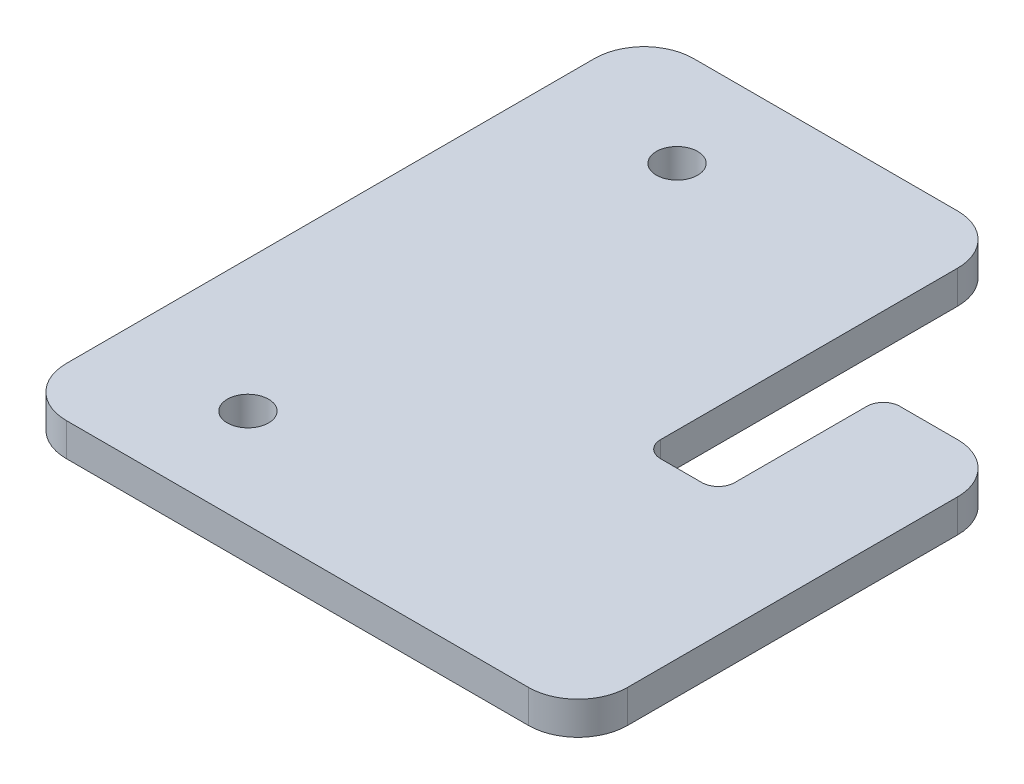
ISO-10303-21;
HEADER;
FILE_DESCRIPTION(('STEP AP214'),'2;1');
FILE_NAME('part.step','',(''),(''),'','','');
FILE_SCHEMA(('AUTOMOTIVE_DESIGN { 1 0 10303 214 1 1 1 1 }'));
ENDSEC;
DATA;
#1=APPLICATION_CONTEXT('core data for automotive mechanical design processes');
#2=APPLICATION_PROTOCOL_DEFINITION('international standard','automotive_design',2000,#1);
#3=PRODUCT_CONTEXT('',#1,'mechanical');
#4=PRODUCT('Part','Part','',(#3));
#5=PRODUCT_RELATED_PRODUCT_CATEGORY('part','',(#4));
#6=PRODUCT_DEFINITION_FORMATION('','',#4);
#7=PRODUCT_DEFINITION_CONTEXT('part definition',#1,'design');
#8=PRODUCT_DEFINITION('design','',#6,#7);
#9=PRODUCT_DEFINITION_SHAPE('','',#8);
#10=(LENGTH_UNIT() NAMED_UNIT(*) SI_UNIT(.MILLI.,.METRE.));
#11=(NAMED_UNIT(*) PLANE_ANGLE_UNIT() SI_UNIT($,.RADIAN.));
#12=(NAMED_UNIT(*) SI_UNIT($,.STERADIAN.) SOLID_ANGLE_UNIT());
#13=UNCERTAINTY_MEASURE_WITH_UNIT(LENGTH_MEASURE(1.E-05),#10,'distance_accuracy_value','');
#14=(GEOMETRIC_REPRESENTATION_CONTEXT(3) GLOBAL_UNCERTAINTY_ASSIGNED_CONTEXT((#13)) GLOBAL_UNIT_ASSIGNED_CONTEXT((#10,
#11,#12)) REPRESENTATION_CONTEXT('',''));
#15=CARTESIAN_POINT('',(0.,0.,0.));
#16=DIRECTION('',(0.,0.,1.));
#17=DIRECTION('',(1.,0.,0.));
#18=AXIS2_PLACEMENT_3D('',#15,#16,#17);
#19=CARTESIAN_POINT('',(-17.,-2.,19.));
#20=DIRECTION('',(-1.,0.,0.));
#21=DIRECTION('',(0.,0.,1.));
#22=AXIS2_PLACEMENT_3D('',#19,#20,#21);
#23=PLANE('',#22);
#24=DIRECTION('',(0.,0.,1.));
#25=VECTOR('',#24,1.);
#26=CARTESIAN_POINT('',(-17.,0.,19.));
#27=LINE('',#26,#25);
#28=CARTESIAN_POINT('',(-17.,0.,-16.));
#29=VERTEX_POINT('',#28);
#30=CARTESIAN_POINT('',(-17.,0.,16.));
#31=VERTEX_POINT('',#30);
#32=EDGE_CURVE('E256',#29,#31,#27,.T.);
#33=ORIENTED_EDGE('',*,*,#32,.F.);
#34=DIRECTION('',(0.,1.,0.));
#35=VECTOR('',#34,1.);
#36=CARTESIAN_POINT('',(-17.,-2.,-16.));
#37=LINE('',#36,#35);
#38=CARTESIAN_POINT('',(-17.,-2.,-16.));
#39=VERTEX_POINT('',#38);
#40=EDGE_CURVE('E11',#29,#39,#37,.F.);
#41=ORIENTED_EDGE('',*,*,#40,.T.);
#42=DIRECTION('',(0.,0.,1.));
#43=VECTOR('',#42,1.);
#44=CARTESIAN_POINT('',(-17.,-2.,19.));
#45=LINE('',#44,#43);
#46=CARTESIAN_POINT('',(-17.,-2.,16.));
#47=VERTEX_POINT('',#46);
#48=EDGE_CURVE('E259',#39,#47,#45,.T.);
#49=ORIENTED_EDGE('',*,*,#48,.T.);
#50=DIRECTION('',(0.,1.,0.));
#51=VECTOR('',#50,1.);
#52=CARTESIAN_POINT('',(-17.,-2.,16.));
#53=LINE('',#52,#51);
#54=EDGE_CURVE('E57',#47,#31,#53,.T.);
#55=ORIENTED_EDGE('',*,*,#54,.T.);
#56=EDGE_LOOP('',(#33,#41,#49,#55));
#57=FACE_BOUND('',#56,.T.);
#58=ADVANCED_FACE('F49',(#57),#23,.T.);
#59=CARTESIAN_POINT('',(17.,-2.,-19.));
#60=DIRECTION('',(0.,0.,-1.));
#61=DIRECTION('',(-1.,0.,0.));
#62=AXIS2_PLACEMENT_3D('',#59,#60,#61);
#63=PLANE('',#62);
#64=DIRECTION('',(-1.,0.,0.));
#65=VECTOR('',#64,1.);
#66=CARTESIAN_POINT('',(17.,0.,-19.));
#67=LINE('',#66,#65);
#68=CARTESIAN_POINT('',(1.99999999999999,0.,-19.));
#69=VERTEX_POINT('',#68);
#70=CARTESIAN_POINT('',(-14.,0.,-19.));
#71=VERTEX_POINT('',#70);
#72=EDGE_CURVE('E276',#69,#71,#67,.T.);
#73=ORIENTED_EDGE('',*,*,#72,.F.);
#74=DIRECTION('',(0.,1.,0.));
#75=VECTOR('',#74,1.);
#76=CARTESIAN_POINT('',(1.99999999999999,-2.,-19.));
#77=LINE('',#76,#75);
#78=CARTESIAN_POINT('',(1.99999999999999,-2.,-19.));
#79=VERTEX_POINT('',#78);
#80=EDGE_CURVE('E250',#69,#79,#77,.F.);
#81=ORIENTED_EDGE('',*,*,#80,.T.);
#82=DIRECTION('',(-1.,0.,0.));
#83=VECTOR('',#82,1.);
#84=CARTESIAN_POINT('',(17.,-2.,-19.));
#85=LINE('',#84,#83);
#86=CARTESIAN_POINT('',(-14.,-2.,-19.));
#87=VERTEX_POINT('',#86);
#88=EDGE_CURVE('E272',#79,#87,#85,.T.);
#89=ORIENTED_EDGE('',*,*,#88,.T.);
#90=DIRECTION('',(0.,1.,0.));
#91=VECTOR('',#90,1.);
#92=CARTESIAN_POINT('',(-14.,-2.,-19.));
#93=LINE('',#92,#91);
#94=EDGE_CURVE('E247',#87,#71,#93,.T.);
#95=ORIENTED_EDGE('',*,*,#94,.T.);
#96=EDGE_LOOP('',(#73,#81,#89,#95));
#97=FACE_BOUND('',#96,.T.);
#98=ADVANCED_FACE('F328',(#97),#63,.T.);
#99=CARTESIAN_POINT('',(17.,-2.,19.));
#100=DIRECTION('',(1.,0.,0.));
#101=DIRECTION('',(0.,0.,-1.));
#102=AXIS2_PLACEMENT_3D('',#99,#100,#101);
#103=PLANE('',#102);
#104=DIRECTION('',(0.,0.,-1.));
#105=VECTOR('',#104,1.);
#106=CARTESIAN_POINT('',(17.,-2.,19.));
#107=LINE('',#106,#105);
#108=CARTESIAN_POINT('',(17.,-2.,16.));
#109=VERTEX_POINT('',#108);
#110=CARTESIAN_POINT('',(17.,-2.,-4.));
#111=VERTEX_POINT('',#110);
#112=EDGE_CURVE('E318',#109,#111,#107,.T.);
#113=ORIENTED_EDGE('',*,*,#112,.T.);
#114=DIRECTION('',(0.,-1.,0.));
#115=VECTOR('',#114,1.);
#116=CARTESIAN_POINT('',(17.,0.,-4.));
#117=LINE('',#116,#115);
#118=CARTESIAN_POINT('',(17.,0.,-4.));
#119=VERTEX_POINT('',#118);
#120=EDGE_CURVE('E231',#111,#119,#117,.F.);
#121=ORIENTED_EDGE('',*,*,#120,.T.);
#122=DIRECTION('',(0.,0.,-1.));
#123=VECTOR('',#122,1.);
#124=CARTESIAN_POINT('',(17.,0.,19.));
#125=LINE('',#124,#123);
#126=CARTESIAN_POINT('',(17.,0.,16.));
#127=VERTEX_POINT('',#126);
#128=EDGE_CURVE('E266',#127,#119,#125,.T.);
#129=ORIENTED_EDGE('',*,*,#128,.F.);
#130=DIRECTION('',(0.,1.,0.));
#131=VECTOR('',#130,1.);
#132=CARTESIAN_POINT('',(17.,-2.,16.));
#133=LINE('',#132,#131);
#134=EDGE_CURVE('E229',#127,#109,#133,.F.);
#135=ORIENTED_EDGE('',*,*,#134,.T.);
#136=EDGE_LOOP('',(#113,#121,#129,#135));
#137=FACE_BOUND('',#136,.T.);
#138=ADVANCED_FACE('F339',(#137),#103,.T.);
#139=CARTESIAN_POINT('',(17.,-2.,19.));
#140=DIRECTION('',(0.,0.,1.));
#141=DIRECTION('',(1.,0.,0.));
#142=AXIS2_PLACEMENT_3D('',#139,#140,#141);
#143=PLANE('',#142);
#144=DIRECTION('',(1.,0.,0.));
#145=VECTOR('',#144,1.);
#146=CARTESIAN_POINT('',(17.,-2.,19.));
#147=LINE('',#146,#145);
#148=CARTESIAN_POINT('',(-14.,-2.,19.));
#149=VERTEX_POINT('',#148);
#150=CARTESIAN_POINT('',(14.,-2.,19.));
#151=VERTEX_POINT('',#150);
#152=EDGE_CURVE('E316',#149,#151,#147,.T.);
#153=ORIENTED_EDGE('',*,*,#152,.T.);
#154=DIRECTION('',(0.,1.,0.));
#155=VECTOR('',#154,1.);
#156=CARTESIAN_POINT('',(14.,-2.,19.));
#157=LINE('',#156,#155);
#158=CARTESIAN_POINT('',(14.,0.,19.));
#159=VERTEX_POINT('',#158);
#160=EDGE_CURVE('E242',#151,#159,#157,.T.);
#161=ORIENTED_EDGE('',*,*,#160,.T.);
#162=DIRECTION('',(1.,0.,0.));
#163=VECTOR('',#162,1.);
#164=CARTESIAN_POINT('',(17.,0.,19.));
#165=LINE('',#164,#163);
#166=CARTESIAN_POINT('',(-14.,0.,19.));
#167=VERTEX_POINT('',#166);
#168=EDGE_CURVE('E263',#167,#159,#165,.T.);
#169=ORIENTED_EDGE('',*,*,#168,.F.);
#170=DIRECTION('',(0.,1.,0.));
#171=VECTOR('',#170,1.);
#172=CARTESIAN_POINT('',(-14.,-2.,19.));
#173=LINE('',#172,#171);
#174=EDGE_CURVE('E240',#167,#149,#173,.F.);
#175=ORIENTED_EDGE('',*,*,#174,.T.);
#176=EDGE_LOOP('',(#153,#161,#169,#175));
#177=FACE_BOUND('',#176,.T.);
#178=ADVANCED_FACE('F337',(#177),#143,.T.);
#179=CARTESIAN_POINT('',(0.,-2.,0.));
#180=DIRECTION('',(0.,1.,0.));
#181=DIRECTION('',(0.,0.,1.));
#182=AXIS2_PLACEMENT_3D('',#179,#180,#181);
#183=PLANE('',#182);
#184=CARTESIAN_POINT('',(-9.00000000000001,-2.,13.));
#185=DIRECTION('',(0.,1.,0.));
#186=DIRECTION('',(0.,0.,1.));
#187=AXIS2_PLACEMENT_3D('',#184,#185,#186);
#188=CIRCLE('',#187,1.25);
#189=CARTESIAN_POINT('',(-9.00000000000001,-2.,14.25));
#190=VERTEX_POINT('',#189);
#191=EDGE_CURVE('E310',#190,#190,#188,.T.);
#192=ORIENTED_EDGE('',*,*,#191,.T.);
#193=EDGE_LOOP('',(#192));
#194=FACE_BOUND('',#193,.T.);
#195=CARTESIAN_POINT('',(-9.00000000000001,-2.,-13.));
#196=DIRECTION('',(0.,1.,0.));
#197=DIRECTION('',(0.,0.,1.));
#198=AXIS2_PLACEMENT_3D('',#195,#196,#197);
#199=CIRCLE('',#198,1.25);
#200=CARTESIAN_POINT('',(-9.00000000000001,-2.,-11.75));
#201=VERTEX_POINT('',#200);
#202=EDGE_CURVE('E264',#201,#201,#199,.T.);
#203=ORIENTED_EDGE('',*,*,#202,.T.);
#204=EDGE_LOOP('',(#203));
#205=FACE_BOUND('',#204,.T.);
#206=DIRECTION('',(1.,0.,0.));
#207=VECTOR('',#206,1.);
#208=CARTESIAN_POINT('',(0.,-2.,-7.00000000000001));
#209=LINE('',#208,#207);
#210=CARTESIAN_POINT('',(10.5,-2.,-7.));
#211=VERTEX_POINT('',#210);
#212=CARTESIAN_POINT('',(14.,-2.,-7.));
#213=VERTEX_POINT('',#212);
#214=EDGE_CURVE('E182',#211,#213,#209,.T.);
#215=ORIENTED_EDGE('',*,*,#214,.T.);
#216=CARTESIAN_POINT('',(14.,-2.,-4.));
#217=DIRECTION('',(0.,1.,0.));
#218=DIRECTION('',(0.,0.,1.));
#219=AXIS2_PLACEMENT_3D('',#216,#217,#218);
#220=CIRCLE('',#219,3.);
#221=EDGE_CURVE('E227',#213,#111,#220,.F.);
#222=ORIENTED_EDGE('',*,*,#221,.T.);
#223=ORIENTED_EDGE('',*,*,#112,.F.);
#224=CARTESIAN_POINT('',(14.,-2.,16.));
#225=DIRECTION('',(0.,1.,0.));
#226=DIRECTION('',(0.,0.,1.));
#227=AXIS2_PLACEMENT_3D('',#224,#225,#226);
#228=CIRCLE('',#227,3.);
#229=EDGE_CURVE('E225',#109,#151,#228,.F.);
#230=ORIENTED_EDGE('',*,*,#229,.T.);
#231=ORIENTED_EDGE('',*,*,#152,.F.);
#232=CARTESIAN_POINT('',(-14.,-2.,16.));
#233=DIRECTION('',(0.,1.,0.));
#234=DIRECTION('',(0.,0.,1.));
#235=AXIS2_PLACEMENT_3D('',#232,#233,#234);
#236=CIRCLE('',#235,3.);
#237=EDGE_CURVE('E219',#149,#47,#236,.F.);
#238=ORIENTED_EDGE('',*,*,#237,.T.);
#239=ORIENTED_EDGE('',*,*,#48,.F.);
#240=CARTESIAN_POINT('',(-14.,-2.,-16.));
#241=DIRECTION('',(0.,1.,0.));
#242=DIRECTION('',(0.,0.,1.));
#243=AXIS2_PLACEMENT_3D('',#240,#241,#242);
#244=CIRCLE('',#243,3.);
#245=EDGE_CURVE('E221',#39,#87,#244,.F.);
#246=ORIENTED_EDGE('',*,*,#245,.T.);
#247=ORIENTED_EDGE('',*,*,#88,.F.);
#248=CARTESIAN_POINT('',(2.,-2.,-16.));
#249=DIRECTION('',(0.,1.,0.));
#250=DIRECTION('',(0.,0.,1.));
#251=AXIS2_PLACEMENT_3D('',#248,#249,#250);
#252=CIRCLE('',#251,3.);
#253=CARTESIAN_POINT('',(4.99999999999999,-2.,-16.));
#254=VERTEX_POINT('',#253);
#255=EDGE_CURVE('E223',#79,#254,#252,.F.);
#256=ORIENTED_EDGE('',*,*,#255,.T.);
#257=DIRECTION('',(0.,0.,1.));
#258=VECTOR('',#257,1.);
#259=CARTESIAN_POINT('',(4.99999999999999,-2.,0.));
#260=LINE('',#259,#258);
#261=CARTESIAN_POINT('',(4.99999999999999,-2.,2.));
#262=VERTEX_POINT('',#261);
#263=EDGE_CURVE('E304',#254,#262,#260,.T.);
#264=ORIENTED_EDGE('',*,*,#263,.T.);
#265=CARTESIAN_POINT('',(5.99999999999999,-2.,2.));
#266=DIRECTION('',(0.,1.,0.));
#267=DIRECTION('',(0.,0.,1.));
#268=AXIS2_PLACEMENT_3D('',#265,#266,#267);
#269=CIRCLE('',#268,1.);
#270=CARTESIAN_POINT('',(5.99999999999999,-2.,3.));
#271=VERTEX_POINT('',#270);
#272=EDGE_CURVE('E215',#262,#271,#269,.T.);
#273=ORIENTED_EDGE('',*,*,#272,.T.);
#274=DIRECTION('',(-1.,0.,0.));
#275=VECTOR('',#274,1.);
#276=CARTESIAN_POINT('',(0.,-2.,3.));
#277=LINE('',#276,#275);
#278=CARTESIAN_POINT('',(8.49999999999999,-2.,3.));
#279=VERTEX_POINT('',#278);
#280=EDGE_CURVE('E298',#279,#271,#277,.T.);
#281=ORIENTED_EDGE('',*,*,#280,.F.);
#282=CARTESIAN_POINT('',(8.49999999999999,-2.,2.));
#283=DIRECTION('',(0.,1.,0.));
#284=DIRECTION('',(0.,0.,1.));
#285=AXIS2_PLACEMENT_3D('',#282,#283,#284);
#286=CIRCLE('',#285,1.);
#287=CARTESIAN_POINT('',(9.49999999999999,-2.,2.));
#288=VERTEX_POINT('',#287);
#289=EDGE_CURVE('E210',#279,#288,#286,.T.);
#290=ORIENTED_EDGE('',*,*,#289,.T.);
#291=DIRECTION('',(0.,0.,-1.));
#292=VECTOR('',#291,1.);
#293=CARTESIAN_POINT('',(9.49999999999999,-2.,0.));
#294=LINE('',#293,#292);
#295=CARTESIAN_POINT('',(9.49999999999999,-2.,-6.));
#296=VERTEX_POINT('',#295);
#297=EDGE_CURVE('E297',#288,#296,#294,.T.);
#298=ORIENTED_EDGE('',*,*,#297,.T.);
#299=CARTESIAN_POINT('',(10.5,-2.,-6.));
#300=DIRECTION('',(0.,1.,0.));
#301=DIRECTION('',(0.,0.,1.));
#302=AXIS2_PLACEMENT_3D('',#299,#300,#301);
#303=CIRCLE('',#302,1.);
#304=EDGE_CURVE('E198',#296,#211,#303,.F.);
#305=ORIENTED_EDGE('',*,*,#304,.T.);
#306=EDGE_LOOP('',(#215,#222,#223,#230,#231,#238,#239,#246,#247,#256,#264,#273,#281,#290,#298,#305));
#307=FACE_BOUND('',#306,.T.);
#308=ADVANCED_FACE('F296',(#194,#205,#307),#183,.F.);
#309=CARTESIAN_POINT('',(0.,0.,0.));
#310=DIRECTION('',(0.,1.,0.));
#311=DIRECTION('',(0.,0.,1.));
#312=AXIS2_PLACEMENT_3D('',#309,#310,#311);
#313=PLANE('',#312);
#314=ORIENTED_EDGE('',*,*,#128,.T.);
#315=CARTESIAN_POINT('',(14.,0.,-4.));
#316=DIRECTION('',(0.,1.,0.));
#317=DIRECTION('',(0.,0.,1.));
#318=AXIS2_PLACEMENT_3D('',#315,#316,#317);
#319=CIRCLE('',#318,3.);
#320=CARTESIAN_POINT('',(14.,0.,-7.));
#321=VERTEX_POINT('',#320);
#322=EDGE_CURVE('E188',#119,#321,#319,.T.);
#323=ORIENTED_EDGE('',*,*,#322,.T.);
#324=DIRECTION('',(1.,0.,0.));
#325=VECTOR('',#324,1.);
#326=CARTESIAN_POINT('',(0.,0.,-7.00000000000001));
#327=LINE('',#326,#325);
#328=CARTESIAN_POINT('',(10.5,0.,-7.));
#329=VERTEX_POINT('',#328);
#330=EDGE_CURVE('E179',#329,#321,#327,.T.);
#331=ORIENTED_EDGE('',*,*,#330,.F.);
#332=CARTESIAN_POINT('',(10.5,0.,-6.));
#333=DIRECTION('',(0.,1.,0.));
#334=DIRECTION('',(0.,0.,1.));
#335=AXIS2_PLACEMENT_3D('',#332,#333,#334);
#336=CIRCLE('',#335,1.);
#337=CARTESIAN_POINT('',(9.49999999999999,0.,-6.));
#338=VERTEX_POINT('',#337);
#339=EDGE_CURVE('E163',#329,#338,#336,.T.);
#340=ORIENTED_EDGE('',*,*,#339,.T.);
#341=DIRECTION('',(0.,0.,-1.));
#342=VECTOR('',#341,1.);
#343=CARTESIAN_POINT('',(9.49999999999999,0.,0.));
#344=LINE('',#343,#342);
#345=CARTESIAN_POINT('',(9.49999999999999,0.,2.));
#346=VERTEX_POINT('',#345);
#347=EDGE_CURVE('E189',#346,#338,#344,.T.);
#348=ORIENTED_EDGE('',*,*,#347,.F.);
#349=CARTESIAN_POINT('',(8.49999999999999,0.,2.));
#350=DIRECTION('',(0.,1.,0.));
#351=DIRECTION('',(0.,0.,1.));
#352=AXIS2_PLACEMENT_3D('',#349,#350,#351);
#353=CIRCLE('',#352,1.);
#354=CARTESIAN_POINT('',(8.49999999999999,0.,3.));
#355=VERTEX_POINT('',#354);
#356=EDGE_CURVE('E208',#346,#355,#353,.F.);
#357=ORIENTED_EDGE('',*,*,#356,.T.);
#358=DIRECTION('',(-1.,0.,0.));
#359=VECTOR('',#358,1.);
#360=CARTESIAN_POINT('',(0.,0.,3.));
#361=LINE('',#360,#359);
#362=CARTESIAN_POINT('',(5.99999999999999,0.,3.));
#363=VERTEX_POINT('',#362);
#364=EDGE_CURVE('E191',#355,#363,#361,.T.);
#365=ORIENTED_EDGE('',*,*,#364,.T.);
#366=CARTESIAN_POINT('',(5.99999999999999,0.,2.));
#367=DIRECTION('',(0.,1.,0.));
#368=DIRECTION('',(0.,0.,1.));
#369=AXIS2_PLACEMENT_3D('',#366,#367,#368);
#370=CIRCLE('',#369,1.);
#371=CARTESIAN_POINT('',(4.99999999999999,0.,2.));
#372=VERTEX_POINT('',#371);
#373=EDGE_CURVE('E212',#363,#372,#370,.F.);
#374=ORIENTED_EDGE('',*,*,#373,.T.);
#375=DIRECTION('',(0.,0.,1.));
#376=VECTOR('',#375,1.);
#377=CARTESIAN_POINT('',(4.99999999999999,0.,0.));
#378=LINE('',#377,#376);
#379=CARTESIAN_POINT('',(4.99999999999999,0.,-16.));
#380=VERTEX_POINT('',#379);
#381=EDGE_CURVE('E278',#380,#372,#378,.T.);
#382=ORIENTED_EDGE('',*,*,#381,.F.);
#383=CARTESIAN_POINT('',(2.,0.,-16.));
#384=DIRECTION('',(0.,1.,0.));
#385=DIRECTION('',(0.,0.,1.));
#386=AXIS2_PLACEMENT_3D('',#383,#384,#385);
#387=CIRCLE('',#386,3.);
#388=EDGE_CURVE('E236',#380,#69,#387,.T.);
#389=ORIENTED_EDGE('',*,*,#388,.T.);
#390=ORIENTED_EDGE('',*,*,#72,.T.);
#391=CARTESIAN_POINT('',(-14.,0.,-16.));
#392=DIRECTION('',(0.,1.,0.));
#393=DIRECTION('',(0.,0.,1.));
#394=AXIS2_PLACEMENT_3D('',#391,#392,#393);
#395=CIRCLE('',#394,3.);
#396=EDGE_CURVE('E234',#71,#29,#395,.T.);
#397=ORIENTED_EDGE('',*,*,#396,.T.);
#398=ORIENTED_EDGE('',*,*,#32,.T.);
#399=CARTESIAN_POINT('',(-14.,0.,16.));
#400=DIRECTION('',(0.,1.,0.));
#401=DIRECTION('',(0.,0.,1.));
#402=AXIS2_PLACEMENT_3D('',#399,#400,#401);
#403=CIRCLE('',#402,3.);
#404=EDGE_CURVE('E72',#31,#167,#403,.T.);
#405=ORIENTED_EDGE('',*,*,#404,.T.);
#406=ORIENTED_EDGE('',*,*,#168,.T.);
#407=CARTESIAN_POINT('',(14.,0.,16.));
#408=DIRECTION('',(0.,1.,0.));
#409=DIRECTION('',(0.,0.,1.));
#410=AXIS2_PLACEMENT_3D('',#407,#408,#409);
#411=CIRCLE('',#410,3.);
#412=EDGE_CURVE('E64',#159,#127,#411,.T.);
#413=ORIENTED_EDGE('',*,*,#412,.T.);
#414=EDGE_LOOP('',(#314,#323,#331,#340,#348,#357,#365,#374,#382,#389,#390,#397,#398,#405,#406,#413));
#415=FACE_BOUND('',#414,.T.);
#416=CARTESIAN_POINT('',(-9.00000000000001,0.,13.));
#417=DIRECTION('',(0.,1.,0.));
#418=DIRECTION('',(0.,0.,1.));
#419=AXIS2_PLACEMENT_3D('',#416,#417,#418);
#420=CIRCLE('',#419,1.24999999999999);
#421=CARTESIAN_POINT('',(-9.00000000000001,0.,14.25));
#422=VERTEX_POINT('',#421);
#423=EDGE_CURVE('E302',#422,#422,#420,.T.);
#424=ORIENTED_EDGE('',*,*,#423,.F.);
#425=EDGE_LOOP('',(#424));
#426=FACE_BOUND('',#425,.T.);
#427=CARTESIAN_POINT('',(-9.00000000000001,0.,-13.));
#428=DIRECTION('',(0.,1.,0.));
#429=DIRECTION('',(0.,0.,1.));
#430=AXIS2_PLACEMENT_3D('',#427,#428,#429);
#431=CIRCLE('',#430,1.24999999999999);
#432=CARTESIAN_POINT('',(-9.00000000000001,0.,-11.75));
#433=VERTEX_POINT('',#432);
#434=EDGE_CURVE('E269',#433,#433,#431,.T.);
#435=ORIENTED_EDGE('',*,*,#434,.F.);
#436=EDGE_LOOP('',(#435));
#437=FACE_BOUND('',#436,.T.);
#438=ADVANCED_FACE('F185',(#415,#426,#437),#313,.T.);
#439=CARTESIAN_POINT('',(-9.00000000000001,0.,-13.));
#440=DIRECTION('',(0.,1.,0.));
#441=DIRECTION('',(0.,0.,1.));
#442=AXIS2_PLACEMENT_3D('',#439,#440,#441);
#443=CYLINDRICAL_SURFACE('',#442,1.24999999999999);
#444=ORIENTED_EDGE('',*,*,#202,.F.);
#445=EDGE_LOOP('',(#444));
#446=FACE_BOUND('',#445,.T.);
#447=ORIENTED_EDGE('',*,*,#434,.T.);
#448=EDGE_LOOP('',(#447));
#449=FACE_BOUND('',#448,.T.);
#450=ADVANCED_FACE('F430',(#446,#449),#443,.F.);
#451=CARTESIAN_POINT('',(-9.00000000000001,0.,13.));
#452=DIRECTION('',(0.,1.,0.));
#453=DIRECTION('',(0.,0.,1.));
#454=AXIS2_PLACEMENT_3D('',#451,#452,#453);
#455=CYLINDRICAL_SURFACE('',#454,1.24999999999999);
#456=ORIENTED_EDGE('',*,*,#191,.F.);
#457=EDGE_LOOP('',(#456));
#458=FACE_BOUND('',#457,.T.);
#459=ORIENTED_EDGE('',*,*,#423,.T.);
#460=EDGE_LOOP('',(#459));
#461=FACE_BOUND('',#460,.T.);
#462=ADVANCED_FACE('F427',(#458,#461),#455,.F.);
#463=CARTESIAN_POINT('',(9.49999999999999,-12.,-7.));
#464=DIRECTION('',(0.,0.,1.));
#465=DIRECTION('',(1.,0.,0.));
#466=AXIS2_PLACEMENT_3D('',#463,#464,#465);
#467=PLANE('',#466);
#468=ORIENTED_EDGE('',*,*,#330,.T.);
#469=DIRECTION('',(0.,-1.,0.));
#470=VECTOR('',#469,1.);
#471=CARTESIAN_POINT('',(14.,-2.,-7.));
#472=LINE('',#471,#470);
#473=EDGE_CURVE('E217',#321,#213,#472,.T.);
#474=ORIENTED_EDGE('',*,*,#473,.T.);
#475=ORIENTED_EDGE('',*,*,#214,.F.);
#476=DIRECTION('',(0.,1.,0.));
#477=VECTOR('',#476,1.);
#478=CARTESIAN_POINT('',(10.5,-12.,-7.));
#479=LINE('',#478,#477);
#480=EDGE_CURVE('E167',#211,#329,#479,.T.);
#481=ORIENTED_EDGE('',*,*,#480,.T.);
#482=EDGE_LOOP('',(#468,#474,#475,#481));
#483=FACE_BOUND('',#482,.T.);
#484=ADVANCED_FACE('F177',(#483),#467,.F.);
#485=CARTESIAN_POINT('',(9.49999999999999,-12.,3.));
#486=DIRECTION('',(1.,0.,0.));
#487=DIRECTION('',(0.,0.,-1.));
#488=AXIS2_PLACEMENT_3D('',#485,#486,#487);
#489=PLANE('',#488);
#490=ORIENTED_EDGE('',*,*,#347,.T.);
#491=DIRECTION('',(0.,1.,0.));
#492=VECTOR('',#491,1.);
#493=CARTESIAN_POINT('',(9.49999999999999,-12.,-6.00000000000001));
#494=LINE('',#493,#492);
#495=EDGE_CURVE('E168',#338,#296,#494,.F.);
#496=ORIENTED_EDGE('',*,*,#495,.T.);
#497=ORIENTED_EDGE('',*,*,#297,.F.);
#498=DIRECTION('',(0.,1.,0.));
#499=VECTOR('',#498,1.);
#500=CARTESIAN_POINT('',(9.49999999999999,-12.,2.));
#501=LINE('',#500,#499);
#502=EDGE_CURVE('E172',#288,#346,#501,.T.);
#503=ORIENTED_EDGE('',*,*,#502,.T.);
#504=EDGE_LOOP('',(#490,#496,#497,#503));
#505=FACE_BOUND('',#504,.T.);
#506=ADVANCED_FACE('F300',(#505),#489,.F.);
#507=CARTESIAN_POINT('',(9.49999999999999,-12.,3.));
#508=DIRECTION('',(0.,0.,-1.));
#509=DIRECTION('',(-1.,0.,0.));
#510=AXIS2_PLACEMENT_3D('',#507,#508,#509);
#511=PLANE('',#510);
#512=ORIENTED_EDGE('',*,*,#364,.F.);
#513=DIRECTION('',(0.,1.,0.));
#514=VECTOR('',#513,1.);
#515=CARTESIAN_POINT('',(8.49999999999999,-12.,3.));
#516=LINE('',#515,#514);
#517=EDGE_CURVE('E203',#355,#279,#516,.F.);
#518=ORIENTED_EDGE('',*,*,#517,.T.);
#519=ORIENTED_EDGE('',*,*,#280,.T.);
#520=DIRECTION('',(0.,1.,0.));
#521=VECTOR('',#520,1.);
#522=CARTESIAN_POINT('',(5.99999999999999,-12.,3.));
#523=LINE('',#522,#521);
#524=EDGE_CURVE('E200',#271,#363,#523,.T.);
#525=ORIENTED_EDGE('',*,*,#524,.T.);
#526=EDGE_LOOP('',(#512,#518,#519,#525));
#527=FACE_BOUND('',#526,.T.);
#528=ADVANCED_FACE('F285',(#527),#511,.T.);
#529=CARTESIAN_POINT('',(5.,-12.,-19.));
#530=DIRECTION('',(-1.,0.,0.));
#531=DIRECTION('',(0.,0.,1.));
#532=AXIS2_PLACEMENT_3D('',#529,#530,#531);
#533=PLANE('',#532);
#534=ORIENTED_EDGE('',*,*,#263,.F.);
#535=DIRECTION('',(0.,1.,0.));
#536=VECTOR('',#535,1.);
#537=CARTESIAN_POINT('',(5.,0.,-16.));
#538=LINE('',#537,#536);
#539=EDGE_CURVE('E244',#254,#380,#538,.T.);
#540=ORIENTED_EDGE('',*,*,#539,.T.);
#541=ORIENTED_EDGE('',*,*,#381,.T.);
#542=DIRECTION('',(0.,1.,0.));
#543=VECTOR('',#542,1.);
#544=CARTESIAN_POINT('',(4.99999999999999,-12.,1.99999999999999));
#545=LINE('',#544,#543);
#546=EDGE_CURVE('E205',#372,#262,#545,.F.);
#547=ORIENTED_EDGE('',*,*,#546,.T.);
#548=EDGE_LOOP('',(#534,#540,#541,#547));
#549=FACE_BOUND('',#548,.T.);
#550=ADVANCED_FACE('F367',(#549),#533,.F.);
#551=CARTESIAN_POINT('',(10.5,-12.,-6.));
#552=DIRECTION('',(0.,1.,0.));
#553=DIRECTION('',(0.,0.,1.));
#554=AXIS2_PLACEMENT_3D('',#551,#552,#553);
#555=CYLINDRICAL_SURFACE('',#554,1.);
#556=ORIENTED_EDGE('',*,*,#304,.F.);
#557=ORIENTED_EDGE('',*,*,#495,.F.);
#558=ORIENTED_EDGE('',*,*,#339,.F.);
#559=ORIENTED_EDGE('',*,*,#480,.F.);
#560=EDGE_LOOP('',(#556,#557,#558,#559));
#561=FACE_BOUND('',#560,.T.);
#562=ADVANCED_FACE('F166',(#561),#555,.T.);
#563=CARTESIAN_POINT('',(8.49999999999999,-12.,2.));
#564=DIRECTION('',(0.,1.,0.));
#565=DIRECTION('',(0.,0.,1.));
#566=AXIS2_PLACEMENT_3D('',#563,#564,#565);
#567=CYLINDRICAL_SURFACE('',#566,1.);
#568=ORIENTED_EDGE('',*,*,#289,.F.);
#569=ORIENTED_EDGE('',*,*,#517,.F.);
#570=ORIENTED_EDGE('',*,*,#356,.F.);
#571=ORIENTED_EDGE('',*,*,#502,.F.);
#572=EDGE_LOOP('',(#568,#569,#570,#571));
#573=FACE_BOUND('',#572,.T.);
#574=ADVANCED_FACE('F291',(#573),#567,.F.);
#575=CARTESIAN_POINT('',(5.99999999999999,-12.,2.));
#576=DIRECTION('',(0.,1.,0.));
#577=DIRECTION('',(0.,0.,1.));
#578=AXIS2_PLACEMENT_3D('',#575,#576,#577);
#579=CYLINDRICAL_SURFACE('',#578,1.);
#580=ORIENTED_EDGE('',*,*,#272,.F.);
#581=ORIENTED_EDGE('',*,*,#546,.F.);
#582=ORIENTED_EDGE('',*,*,#373,.F.);
#583=ORIENTED_EDGE('',*,*,#524,.F.);
#584=EDGE_LOOP('',(#580,#581,#582,#583));
#585=FACE_BOUND('',#584,.T.);
#586=ADVANCED_FACE('F345',(#585),#579,.F.);
#587=CARTESIAN_POINT('',(14.,-12.,-4.));
#588=DIRECTION('',(0.,1.,0.));
#589=DIRECTION('',(0.,0.,1.));
#590=AXIS2_PLACEMENT_3D('',#587,#588,#589);
#591=CYLINDRICAL_SURFACE('',#590,3.);
#592=ORIENTED_EDGE('',*,*,#322,.F.);
#593=ORIENTED_EDGE('',*,*,#120,.F.);
#594=ORIENTED_EDGE('',*,*,#221,.F.);
#595=ORIENTED_EDGE('',*,*,#473,.F.);
#596=EDGE_LOOP('',(#592,#593,#594,#595));
#597=FACE_BOUND('',#596,.T.);
#598=ADVANCED_FACE('F343',(#597),#591,.T.);
#599=CARTESIAN_POINT('',(14.,-2.,16.));
#600=DIRECTION('',(0.,1.,0.));
#601=DIRECTION('',(0.,0.,1.));
#602=AXIS2_PLACEMENT_3D('',#599,#600,#601);
#603=CYLINDRICAL_SURFACE('',#602,3.);
#604=ORIENTED_EDGE('',*,*,#229,.F.);
#605=ORIENTED_EDGE('',*,*,#134,.F.);
#606=ORIENTED_EDGE('',*,*,#412,.F.);
#607=ORIENTED_EDGE('',*,*,#160,.F.);
#608=EDGE_LOOP('',(#604,#605,#606,#607));
#609=FACE_BOUND('',#608,.T.);
#610=ADVANCED_FACE('F341',(#609),#603,.T.);
#611=CARTESIAN_POINT('',(2.,-12.,-16.));
#612=DIRECTION('',(0.,-1.,0.));
#613=DIRECTION('',(0.,0.,-1.));
#614=AXIS2_PLACEMENT_3D('',#611,#612,#613);
#615=CYLINDRICAL_SURFACE('',#614,3.);
#616=ORIENTED_EDGE('',*,*,#255,.F.);
#617=ORIENTED_EDGE('',*,*,#80,.F.);
#618=ORIENTED_EDGE('',*,*,#388,.F.);
#619=ORIENTED_EDGE('',*,*,#539,.F.);
#620=EDGE_LOOP('',(#616,#617,#618,#619));
#621=FACE_BOUND('',#620,.T.);
#622=ADVANCED_FACE('F351',(#621),#615,.T.);
#623=CARTESIAN_POINT('',(-14.,-2.,-16.));
#624=DIRECTION('',(0.,1.,0.));
#625=DIRECTION('',(0.,0.,1.));
#626=AXIS2_PLACEMENT_3D('',#623,#624,#625);
#627=CYLINDRICAL_SURFACE('',#626,3.);
#628=ORIENTED_EDGE('',*,*,#245,.F.);
#629=ORIENTED_EDGE('',*,*,#40,.F.);
#630=ORIENTED_EDGE('',*,*,#396,.F.);
#631=ORIENTED_EDGE('',*,*,#94,.F.);
#632=EDGE_LOOP('',(#628,#629,#630,#631));
#633=FACE_BOUND('',#632,.T.);
#634=ADVANCED_FACE('F333',(#633),#627,.T.);
#635=CARTESIAN_POINT('',(-14.,-2.,16.));
#636=DIRECTION('',(0.,1.,0.));
#637=DIRECTION('',(0.,0.,1.));
#638=AXIS2_PLACEMENT_3D('',#635,#636,#637);
#639=CYLINDRICAL_SURFACE('',#638,3.);
#640=ORIENTED_EDGE('',*,*,#237,.F.);
#641=ORIENTED_EDGE('',*,*,#174,.F.);
#642=ORIENTED_EDGE('',*,*,#404,.F.);
#643=ORIENTED_EDGE('',*,*,#54,.F.);
#644=EDGE_LOOP('',(#640,#641,#642,#643));
#645=FACE_BOUND('',#644,.T.);
#646=ADVANCED_FACE('F51',(#645),#639,.T.);
#647=CLOSED_SHELL('',(#58,#98,#138,#178,#308,#438,#450,#462,#484,#506,#528,#550,#562,#574,#586,
#598,#610,#622,#634,#646));
#648=MANIFOLD_SOLID_BREP('B2',#647);
#649=ADVANCED_BREP_SHAPE_REPRESENTATION('',(#18,#648),#14);
#650=SHAPE_DEFINITION_REPRESENTATION(#9,#649);
ENDSEC;
END-ISO-10303-21;
